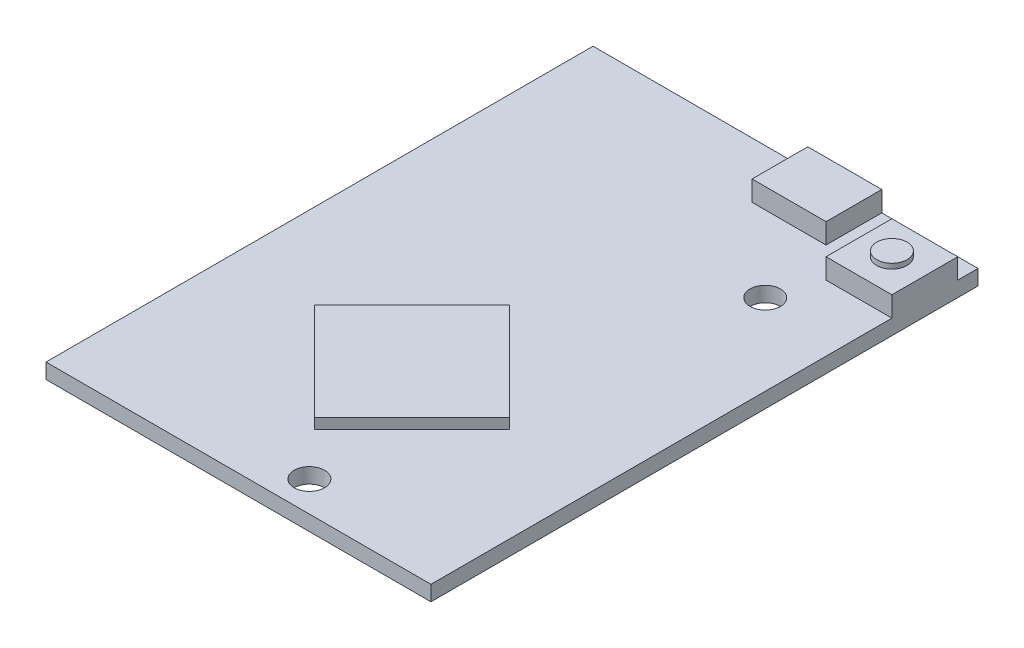
ISO-10303-21;
HEADER;
FILE_DESCRIPTION(('STEP AP214'),'2;1');
FILE_NAME('part.step','',(''),(''),'','','');
FILE_SCHEMA(('AUTOMOTIVE_DESIGN { 1 0 10303 214 1 1 1 1 }'));
ENDSEC;
DATA;
#1=APPLICATION_CONTEXT('core data for automotive mechanical design processes');
#2=APPLICATION_PROTOCOL_DEFINITION('international standard','automotive_design',2000,#1);
#3=PRODUCT_CONTEXT('',#1,'mechanical');
#4=PRODUCT('Part','Part','',(#3));
#5=PRODUCT_RELATED_PRODUCT_CATEGORY('part','',(#4));
#6=PRODUCT_DEFINITION_FORMATION('','',#4);
#7=PRODUCT_DEFINITION_CONTEXT('part definition',#1,'design');
#8=PRODUCT_DEFINITION('design','',#6,#7);
#9=PRODUCT_DEFINITION_SHAPE('','',#8);
#10=(LENGTH_UNIT() NAMED_UNIT(*) SI_UNIT(.MILLI.,.METRE.));
#11=(NAMED_UNIT(*) PLANE_ANGLE_UNIT() SI_UNIT($,.RADIAN.));
#12=(NAMED_UNIT(*) SI_UNIT($,.STERADIAN.) SOLID_ANGLE_UNIT());
#13=UNCERTAINTY_MEASURE_WITH_UNIT(LENGTH_MEASURE(1.E-05),#10,'distance_accuracy_value','');
#14=(GEOMETRIC_REPRESENTATION_CONTEXT(3) GLOBAL_UNCERTAINTY_ASSIGNED_CONTEXT((#13)) GLOBAL_UNIT_ASSIGNED_CONTEXT((#10,
#11,#12)) REPRESENTATION_CONTEXT('',''));
#15=CARTESIAN_POINT('',(0.,0.,0.));
#16=DIRECTION('',(0.,0.,1.));
#17=DIRECTION('',(1.,0.,0.));
#18=AXIS2_PLACEMENT_3D('',#15,#16,#17);
#19=CARTESIAN_POINT('',(0.,1.5,0.));
#20=DIRECTION('',(0.,1.,0.));
#21=DIRECTION('',(0.,0.,1.));
#22=AXIS2_PLACEMENT_3D('',#19,#20,#21);
#23=PLANE('',#22);
#24=CARTESIAN_POINT('',(11.,1.5,-14.));
#25=DIRECTION('',(0.,1.,0.));
#26=DIRECTION('',(0.,0.,1.));
#27=AXIS2_PLACEMENT_3D('',#24,#25,#26);
#28=CIRCLE('',#27,1.5);
#29=CARTESIAN_POINT('',(11.,1.5,-12.5));
#30=VERTEX_POINT('',#29);
#31=EDGE_CURVE('E512',#30,#30,#28,.T.);
#32=ORIENTED_EDGE('',*,*,#31,.F.);
#33=EDGE_LOOP('',(#32));
#34=FACE_BOUND('',#33,.T.);
#35=CARTESIAN_POINT('',(3.99999999999999,1.5,24.));
#36=DIRECTION('',(0.,1.,0.));
#37=DIRECTION('',(0.,0.,1.));
#38=AXIS2_PLACEMENT_3D('',#35,#36,#37);
#39=CIRCLE('',#38,1.5);
#40=CARTESIAN_POINT('',(3.99999999999999,1.5,25.5));
#41=VERTEX_POINT('',#40);
#42=EDGE_CURVE('E516',#41,#41,#39,.T.);
#43=ORIENTED_EDGE('',*,*,#42,.F.);
#44=EDGE_LOOP('',(#43));
#45=FACE_BOUND('',#44,.T.);
#46=DIRECTION('',(-0.707106781186548,0.,0.707106781186547));
#47=VECTOR('',#46,1.);
#48=CARTESIAN_POINT('',(-9.61665222413705,1.5,9.88334777586296));
#49=LINE('',#48,#47);
#50=CARTESIAN_POINT('',(0.,1.5,0.266695551725916));
#51=VERTEX_POINT('',#50);
#52=CARTESIAN_POINT('',(-9.61665222413705,1.5,9.88334777586296));
#53=VERTEX_POINT('',#52);
#54=EDGE_CURVE('E203',#51,#53,#49,.T.);
#55=ORIENTED_EDGE('',*,*,#54,.F.);
#56=DIRECTION('',(-0.707106781186548,0.,-0.707106781186547));
#57=VECTOR('',#56,1.);
#58=CARTESIAN_POINT('',(0.,1.5,0.266695551725916));
#59=LINE('',#58,#57);
#60=CARTESIAN_POINT('',(9.61665222413705,1.5,9.88334777586296));
#61=VERTEX_POINT('',#60);
#62=EDGE_CURVE('E208',#61,#51,#59,.T.);
#63=ORIENTED_EDGE('',*,*,#62,.F.);
#64=DIRECTION('',(0.707106781186548,0.,-0.707106781186547));
#65=VECTOR('',#64,1.);
#66=CARTESIAN_POINT('',(9.61665222413705,1.5,9.88334777586296));
#67=LINE('',#66,#65);
#68=CARTESIAN_POINT('',(0.,1.5,19.5));
#69=VERTEX_POINT('',#68);
#70=EDGE_CURVE('E220',#69,#61,#67,.T.);
#71=ORIENTED_EDGE('',*,*,#70,.F.);
#72=DIRECTION('',(0.707106781186547,0.,0.707106781186547));
#73=VECTOR('',#72,1.);
#74=CARTESIAN_POINT('',(0.,1.5,19.5));
#75=LINE('',#74,#73);
#76=EDGE_CURVE('E217',#53,#69,#75,.T.);
#77=ORIENTED_EDGE('',*,*,#76,.F.);
#78=EDGE_LOOP('',(#55,#63,#71,#77));
#79=FACE_BOUND('',#78,.T.);
#80=DIRECTION('',(0.,0.,1.));
#81=VECTOR('',#80,1.);
#82=CARTESIAN_POINT('',(12.5,1.5,-25.));
#83=LINE('',#82,#81);
#84=CARTESIAN_POINT('',(12.5,1.5,-25.));
#85=VERTEX_POINT('',#84);
#86=CARTESIAN_POINT('',(12.5,1.5,-18.5));
#87=VERTEX_POINT('',#86);
#88=EDGE_CURVE('E48',#85,#87,#83,.T.);
#89=ORIENTED_EDGE('',*,*,#88,.F.);
#90=DIRECTION('',(-1.,0.,0.));
#91=VECTOR('',#90,1.);
#92=CARTESIAN_POINT('',(19.,1.5,-25.));
#93=LINE('',#92,#91);
#94=CARTESIAN_POINT('',(19.,1.5,-25.));
#95=VERTEX_POINT('',#94);
#96=EDGE_CURVE('E527',#95,#85,#93,.T.);
#97=ORIENTED_EDGE('',*,*,#96,.F.);
#98=DIRECTION('',(0.,0.,-1.));
#99=VECTOR('',#98,1.);
#100=CARTESIAN_POINT('',(19.,1.5,-27.));
#101=LINE('',#100,#99);
#102=CARTESIAN_POINT('',(19.,1.5,-27.));
#103=VERTEX_POINT('',#102);
#104=EDGE_CURVE('E167',#95,#103,#101,.T.);
#105=ORIENTED_EDGE('',*,*,#104,.T.);
#106=DIRECTION('',(-1.,0.,0.));
#107=VECTOR('',#106,1.);
#108=CARTESIAN_POINT('',(-19.,1.5,-27.));
#109=LINE('',#108,#107);
#110=CARTESIAN_POINT('',(9.49999999999999,1.5,-27.));
#111=VERTEX_POINT('',#110);
#112=EDGE_CURVE('E240',#103,#111,#109,.T.);
#113=ORIENTED_EDGE('',*,*,#112,.T.);
#114=DIRECTION('',(0.,0.,-1.));
#115=VECTOR('',#114,1.);
#116=CARTESIAN_POINT('',(9.49999999999999,1.5,-27.));
#117=LINE('',#116,#115);
#118=CARTESIAN_POINT('',(9.49999999999999,1.5,-21.5));
#119=VERTEX_POINT('',#118);
#120=EDGE_CURVE('E181',#119,#111,#117,.T.);
#121=ORIENTED_EDGE('',*,*,#120,.F.);
#122=DIRECTION('',(1.,0.,0.));
#123=VECTOR('',#122,1.);
#124=CARTESIAN_POINT('',(2.19999999999999,1.5,-21.5));
#125=LINE('',#124,#123);
#126=CARTESIAN_POINT('',(2.19999999999999,1.5,-21.5));
#127=VERTEX_POINT('',#126);
#128=EDGE_CURVE('E171',#127,#119,#125,.T.);
#129=ORIENTED_EDGE('',*,*,#128,.F.);
#130=DIRECTION('',(0.,0.,1.));
#131=VECTOR('',#130,1.);
#132=CARTESIAN_POINT('',(2.19999999999999,1.5,-27.));
#133=LINE('',#132,#131);
#134=CARTESIAN_POINT('',(2.19999999999999,1.5,-27.));
#135=VERTEX_POINT('',#134);
#136=EDGE_CURVE('E168',#135,#127,#133,.T.);
#137=ORIENTED_EDGE('',*,*,#136,.F.);
#138=CARTESIAN_POINT('',(-19.,1.5,-27.));
#139=VERTEX_POINT('',#138);
#140=EDGE_CURVE('E239',#135,#139,#109,.T.);
#141=ORIENTED_EDGE('',*,*,#140,.T.);
#142=DIRECTION('',(0.,0.,1.));
#143=VECTOR('',#142,1.);
#144=CARTESIAN_POINT('',(-19.,1.5,-27.));
#145=LINE('',#144,#143);
#146=CARTESIAN_POINT('',(-19.,1.5,27.));
#147=VERTEX_POINT('',#146);
#148=EDGE_CURVE('E242',#139,#147,#145,.T.);
#149=ORIENTED_EDGE('',*,*,#148,.T.);
#150=DIRECTION('',(1.,0.,0.));
#151=VECTOR('',#150,1.);
#152=CARTESIAN_POINT('',(-19.,1.5,27.));
#153=LINE('',#152,#151);
#154=CARTESIAN_POINT('',(19.,1.5,27.));
#155=VERTEX_POINT('',#154);
#156=EDGE_CURVE('E244',#147,#155,#153,.T.);
#157=ORIENTED_EDGE('',*,*,#156,.T.);
#158=CARTESIAN_POINT('',(19.,1.5,-18.5));
#159=VERTEX_POINT('',#158);
#160=EDGE_CURVE('E237',#155,#159,#101,.T.);
#161=ORIENTED_EDGE('',*,*,#160,.T.);
#162=DIRECTION('',(1.,0.,0.));
#163=VECTOR('',#162,1.);
#164=CARTESIAN_POINT('',(19.,1.5,-18.5));
#165=LINE('',#164,#163);
#166=EDGE_CURVE('E53',#87,#159,#165,.T.);
#167=ORIENTED_EDGE('',*,*,#166,.F.);
#168=EDGE_LOOP('',(#89,#97,#105,#113,#121,#129,#137,#141,#149,#157,#161,#167));
#169=FACE_BOUND('',#168,.T.);
#170=ADVANCED_FACE('F32',(#34,#45,#79,#169),#23,.T.);
#171=CARTESIAN_POINT('',(19.,1.5,-27.));
#172=DIRECTION('',(-1.,0.,0.));
#173=DIRECTION('',(0.,0.,1.));
#174=AXIS2_PLACEMENT_3D('',#171,#172,#173);
#175=PLANE('',#174);
#176=DIRECTION('',(0.,0.,-1.));
#177=VECTOR('',#176,1.);
#178=CARTESIAN_POINT('',(19.,0.,-27.));
#179=LINE('',#178,#177);
#180=CARTESIAN_POINT('',(19.,0.,27.));
#181=VERTEX_POINT('',#180);
#182=CARTESIAN_POINT('',(19.,0.,-27.));
#183=VERTEX_POINT('',#182);
#184=EDGE_CURVE('E236',#181,#183,#179,.T.);
#185=ORIENTED_EDGE('',*,*,#184,.T.);
#186=DIRECTION('',(0.,-1.,0.));
#187=VECTOR('',#186,1.);
#188=CARTESIAN_POINT('',(19.,1.5,-27.));
#189=LINE('',#188,#187);
#190=EDGE_CURVE('E36',#103,#183,#189,.T.);
#191=ORIENTED_EDGE('',*,*,#190,.F.);
#192=ORIENTED_EDGE('',*,*,#104,.F.);
#193=DIRECTION('',(0.,-1.,0.));
#194=VECTOR('',#193,1.);
#195=CARTESIAN_POINT('',(19.,3.5,-25.));
#196=LINE('',#195,#194);
#197=CARTESIAN_POINT('',(19.,3.5,-25.));
#198=VERTEX_POINT('',#197);
#199=EDGE_CURVE('E149',#198,#95,#196,.T.);
#200=ORIENTED_EDGE('',*,*,#199,.F.);
#201=DIRECTION('',(0.,0.,-1.));
#202=VECTOR('',#201,1.);
#203=CARTESIAN_POINT('',(19.,3.5,-25.));
#204=LINE('',#203,#202);
#205=CARTESIAN_POINT('',(19.,3.5,-18.5));
#206=VERTEX_POINT('',#205);
#207=EDGE_CURVE('E155',#206,#198,#204,.T.);
#208=ORIENTED_EDGE('',*,*,#207,.F.);
#209=DIRECTION('',(0.,-1.,0.));
#210=VECTOR('',#209,1.);
#211=CARTESIAN_POINT('',(19.,3.5,-18.5));
#212=LINE('',#211,#210);
#213=EDGE_CURVE('E531',#206,#159,#212,.T.);
#214=ORIENTED_EDGE('',*,*,#213,.T.);
#215=ORIENTED_EDGE('',*,*,#160,.F.);
#216=DIRECTION('',(0.,-1.,0.));
#217=VECTOR('',#216,1.);
#218=CARTESIAN_POINT('',(19.,1.5,27.));
#219=LINE('',#218,#217);
#220=EDGE_CURVE('E246',#155,#181,#219,.T.);
#221=ORIENTED_EDGE('',*,*,#220,.T.);
#222=EDGE_LOOP('',(#185,#191,#192,#200,#208,#214,#215,#221));
#223=FACE_BOUND('',#222,.T.);
#224=ADVANCED_FACE('F34',(#223),#175,.F.);
#225=CARTESIAN_POINT('',(-19.,1.5,-27.));
#226=DIRECTION('',(0.,0.,1.));
#227=DIRECTION('',(1.,0.,0.));
#228=AXIS2_PLACEMENT_3D('',#225,#226,#227);
#229=PLANE('',#228);
#230=DIRECTION('',(-1.,0.,0.));
#231=VECTOR('',#230,1.);
#232=CARTESIAN_POINT('',(-19.,0.,-27.));
#233=LINE('',#232,#231);
#234=CARTESIAN_POINT('',(-19.,0.,-27.));
#235=VERTEX_POINT('',#234);
#236=EDGE_CURVE('E248',#183,#235,#233,.T.);
#237=ORIENTED_EDGE('',*,*,#236,.T.);
#238=DIRECTION('',(0.,-1.,0.));
#239=VECTOR('',#238,1.);
#240=CARTESIAN_POINT('',(-19.,1.5,-27.));
#241=LINE('',#240,#239);
#242=EDGE_CURVE('E258',#139,#235,#241,.T.);
#243=ORIENTED_EDGE('',*,*,#242,.F.);
#244=ORIENTED_EDGE('',*,*,#140,.F.);
#245=DIRECTION('',(0.,-1.,0.));
#246=VECTOR('',#245,1.);
#247=CARTESIAN_POINT('',(2.19999999999999,3.5,-27.));
#248=LINE('',#247,#246);
#249=CARTESIAN_POINT('',(2.19999999999999,3.5,-27.));
#250=VERTEX_POINT('',#249);
#251=EDGE_CURVE('E186',#250,#135,#248,.T.);
#252=ORIENTED_EDGE('',*,*,#251,.F.);
#253=DIRECTION('',(-1.,0.,0.));
#254=VECTOR('',#253,1.);
#255=CARTESIAN_POINT('',(2.19999999999999,3.5,-27.));
#256=LINE('',#255,#254);
#257=CARTESIAN_POINT('',(9.49999999999999,3.5,-27.));
#258=VERTEX_POINT('',#257);
#259=EDGE_CURVE('E185',#258,#250,#256,.T.);
#260=ORIENTED_EDGE('',*,*,#259,.F.);
#261=DIRECTION('',(0.,-1.,0.));
#262=VECTOR('',#261,1.);
#263=CARTESIAN_POINT('',(9.49999999999999,3.5,-27.));
#264=LINE('',#263,#262);
#265=EDGE_CURVE('E194',#258,#111,#264,.T.);
#266=ORIENTED_EDGE('',*,*,#265,.T.);
#267=ORIENTED_EDGE('',*,*,#112,.F.);
#268=ORIENTED_EDGE('',*,*,#190,.T.);
#269=EDGE_LOOP('',(#237,#243,#244,#252,#260,#266,#267,#268));
#270=FACE_BOUND('',#269,.T.);
#271=ADVANCED_FACE('F267',(#270),#229,.F.);
#272=CARTESIAN_POINT('',(-19.,1.5,-27.));
#273=DIRECTION('',(1.,0.,0.));
#274=DIRECTION('',(0.,0.,-1.));
#275=AXIS2_PLACEMENT_3D('',#272,#273,#274);
#276=PLANE('',#275);
#277=DIRECTION('',(0.,0.,1.));
#278=VECTOR('',#277,1.);
#279=CARTESIAN_POINT('',(-19.,0.,-27.));
#280=LINE('',#279,#278);
#281=CARTESIAN_POINT('',(-19.,0.,27.));
#282=VERTEX_POINT('',#281);
#283=EDGE_CURVE('E250',#235,#282,#280,.T.);
#284=ORIENTED_EDGE('',*,*,#283,.T.);
#285=DIRECTION('',(0.,-1.,0.));
#286=VECTOR('',#285,1.);
#287=CARTESIAN_POINT('',(-19.,1.5,27.));
#288=LINE('',#287,#286);
#289=EDGE_CURVE('E256',#147,#282,#288,.T.);
#290=ORIENTED_EDGE('',*,*,#289,.F.);
#291=ORIENTED_EDGE('',*,*,#148,.F.);
#292=ORIENTED_EDGE('',*,*,#242,.T.);
#293=EDGE_LOOP('',(#284,#290,#291,#292));
#294=FACE_BOUND('',#293,.T.);
#295=ADVANCED_FACE('F275',(#294),#276,.F.);
#296=CARTESIAN_POINT('',(-19.,1.5,27.));
#297=DIRECTION('',(0.,0.,-1.));
#298=DIRECTION('',(-1.,0.,0.));
#299=AXIS2_PLACEMENT_3D('',#296,#297,#298);
#300=PLANE('',#299);
#301=DIRECTION('',(1.,0.,0.));
#302=VECTOR('',#301,1.);
#303=CARTESIAN_POINT('',(-19.,0.,27.));
#304=LINE('',#303,#302);
#305=EDGE_CURVE('E252',#282,#181,#304,.T.);
#306=ORIENTED_EDGE('',*,*,#305,.T.);
#307=ORIENTED_EDGE('',*,*,#220,.F.);
#308=ORIENTED_EDGE('',*,*,#156,.F.);
#309=ORIENTED_EDGE('',*,*,#289,.T.);
#310=EDGE_LOOP('',(#306,#307,#308,#309));
#311=FACE_BOUND('',#310,.T.);
#312=ADVANCED_FACE('F278',(#311),#300,.F.);
#313=CARTESIAN_POINT('',(0.,0.,0.));
#314=DIRECTION('',(0.,1.,0.));
#315=DIRECTION('',(0.,0.,1.));
#316=AXIS2_PLACEMENT_3D('',#313,#314,#315);
#317=PLANE('',#316);
#318=CARTESIAN_POINT('',(11.,0.,-14.));
#319=DIRECTION('',(0.,1.,0.));
#320=DIRECTION('',(0.,0.,1.));
#321=AXIS2_PLACEMENT_3D('',#318,#319,#320);
#322=CIRCLE('',#321,1.5);
#323=CARTESIAN_POINT('',(11.,0.,-12.5));
#324=VERTEX_POINT('',#323);
#325=EDGE_CURVE('E515',#324,#324,#322,.T.);
#326=ORIENTED_EDGE('',*,*,#325,.T.);
#327=EDGE_LOOP('',(#326));
#328=FACE_BOUND('',#327,.T.);
#329=CARTESIAN_POINT('',(3.99999999999999,0.,24.));
#330=DIRECTION('',(0.,1.,0.));
#331=DIRECTION('',(0.,0.,1.));
#332=AXIS2_PLACEMENT_3D('',#329,#330,#331);
#333=CIRCLE('',#332,1.5);
#334=CARTESIAN_POINT('',(3.99999999999999,0.,25.5));
#335=VERTEX_POINT('',#334);
#336=EDGE_CURVE('E517',#335,#335,#333,.T.);
#337=ORIENTED_EDGE('',*,*,#336,.T.);
#338=EDGE_LOOP('',(#337));
#339=FACE_BOUND('',#338,.T.);
#340=ORIENTED_EDGE('',*,*,#184,.F.);
#341=ORIENTED_EDGE('',*,*,#305,.F.);
#342=ORIENTED_EDGE('',*,*,#283,.F.);
#343=ORIENTED_EDGE('',*,*,#236,.F.);
#344=EDGE_LOOP('',(#340,#341,#342,#343));
#345=FACE_BOUND('',#344,.T.);
#346=ADVANCED_FACE('F273',(#328,#339,#345),#317,.F.);
#347=CARTESIAN_POINT('',(-9.61665222413705,2.5,9.88334777586296));
#348=DIRECTION('',(0.707106781186547,0.,0.707106781186548));
#349=DIRECTION('',(0.707106781186548,0.,-0.707106781186547));
#350=AXIS2_PLACEMENT_3D('',#347,#348,#349);
#351=PLANE('',#350);
#352=ORIENTED_EDGE('',*,*,#54,.T.);
#353=DIRECTION('',(0.,-1.,0.));
#354=VECTOR('',#353,1.);
#355=CARTESIAN_POINT('',(-9.61665222413705,2.5,9.88334777586296));
#356=LINE('',#355,#354);
#357=CARTESIAN_POINT('',(-9.61665222413705,2.5,9.88334777586296));
#358=VERTEX_POINT('',#357);
#359=EDGE_CURVE('E233',#358,#53,#356,.T.);
#360=ORIENTED_EDGE('',*,*,#359,.F.);
#361=DIRECTION('',(-0.707106781186548,0.,0.707106781186547));
#362=VECTOR('',#361,1.);
#363=CARTESIAN_POINT('',(-9.61665222413705,2.5,9.88334777586296));
#364=LINE('',#363,#362);
#365=CARTESIAN_POINT('',(0.,2.5,0.266695551725916));
#366=VERTEX_POINT('',#365);
#367=EDGE_CURVE('E204',#366,#358,#364,.T.);
#368=ORIENTED_EDGE('',*,*,#367,.F.);
#369=DIRECTION('',(0.,-1.,0.));
#370=VECTOR('',#369,1.);
#371=CARTESIAN_POINT('',(0.,2.5,0.266695551725916));
#372=LINE('',#371,#370);
#373=EDGE_CURVE('E214',#366,#51,#372,.T.);
#374=ORIENTED_EDGE('',*,*,#373,.T.);
#375=EDGE_LOOP('',(#352,#360,#368,#374));
#376=FACE_BOUND('',#375,.T.);
#377=ADVANCED_FACE('F314',(#376),#351,.F.);
#378=CARTESIAN_POINT('',(0.,2.5,19.5));
#379=DIRECTION('',(0.707106781186547,0.,-0.707106781186547));
#380=DIRECTION('',(-0.707106781186548,0.,-0.707106781186548));
#381=AXIS2_PLACEMENT_3D('',#378,#379,#380);
#382=PLANE('',#381);
#383=ORIENTED_EDGE('',*,*,#76,.T.);
#384=DIRECTION('',(0.,-1.,0.));
#385=VECTOR('',#384,1.);
#386=CARTESIAN_POINT('',(0.,2.5,19.5));
#387=LINE('',#386,#385);
#388=CARTESIAN_POINT('',(0.,2.5,19.5));
#389=VERTEX_POINT('',#388);
#390=EDGE_CURVE('E230',#389,#69,#387,.T.);
#391=ORIENTED_EDGE('',*,*,#390,.F.);
#392=DIRECTION('',(0.707106781186547,0.,0.707106781186547));
#393=VECTOR('',#392,1.);
#394=CARTESIAN_POINT('',(0.,2.5,19.5));
#395=LINE('',#394,#393);
#396=EDGE_CURVE('E207',#358,#389,#395,.T.);
#397=ORIENTED_EDGE('',*,*,#396,.F.);
#398=ORIENTED_EDGE('',*,*,#359,.T.);
#399=EDGE_LOOP('',(#383,#391,#397,#398));
#400=FACE_BOUND('',#399,.T.);
#401=ADVANCED_FACE('F347',(#400),#382,.F.);
#402=CARTESIAN_POINT('',(9.61665222413705,2.5,9.88334777586296));
#403=DIRECTION('',(-0.707106781186547,0.,-0.707106781186548));
#404=DIRECTION('',(-0.707106781186548,0.,0.707106781186547));
#405=AXIS2_PLACEMENT_3D('',#402,#403,#404);
#406=PLANE('',#405);
#407=ORIENTED_EDGE('',*,*,#70,.T.);
#408=DIRECTION('',(0.,-1.,0.));
#409=VECTOR('',#408,1.);
#410=CARTESIAN_POINT('',(9.61665222413705,2.5,9.88334777586296));
#411=LINE('',#410,#409);
#412=CARTESIAN_POINT('',(9.61665222413705,2.5,9.88334777586296));
#413=VERTEX_POINT('',#412);
#414=EDGE_CURVE('E227',#413,#61,#411,.T.);
#415=ORIENTED_EDGE('',*,*,#414,.F.);
#416=DIRECTION('',(0.707106781186548,0.,-0.707106781186547));
#417=VECTOR('',#416,1.);
#418=CARTESIAN_POINT('',(9.61665222413705,2.5,9.88334777586296));
#419=LINE('',#418,#417);
#420=EDGE_CURVE('E210',#389,#413,#419,.T.);
#421=ORIENTED_EDGE('',*,*,#420,.F.);
#422=ORIENTED_EDGE('',*,*,#390,.T.);
#423=EDGE_LOOP('',(#407,#415,#421,#422));
#424=FACE_BOUND('',#423,.T.);
#425=ADVANCED_FACE('F354',(#424),#406,.F.);
#426=CARTESIAN_POINT('',(0.,2.5,0.266695551725916));
#427=DIRECTION('',(-0.707106781186547,0.,0.707106781186548));
#428=DIRECTION('',(0.707106781186548,0.,0.707106781186547));
#429=AXIS2_PLACEMENT_3D('',#426,#427,#428);
#430=PLANE('',#429);
#431=ORIENTED_EDGE('',*,*,#62,.T.);
#432=ORIENTED_EDGE('',*,*,#373,.F.);
#433=DIRECTION('',(-0.707106781186548,0.,-0.707106781186547));
#434=VECTOR('',#433,1.);
#435=CARTESIAN_POINT('',(0.,2.5,0.266695551725916));
#436=LINE('',#435,#434);
#437=EDGE_CURVE('E212',#413,#366,#436,.T.);
#438=ORIENTED_EDGE('',*,*,#437,.F.);
#439=ORIENTED_EDGE('',*,*,#414,.T.);
#440=EDGE_LOOP('',(#431,#432,#438,#439));
#441=FACE_BOUND('',#440,.T.);
#442=ADVANCED_FACE('F361',(#441),#430,.F.);
#443=CARTESIAN_POINT('',(0.,2.5,0.));
#444=DIRECTION('',(0.,-1.,0.));
#445=DIRECTION('',(0.,0.,-1.));
#446=AXIS2_PLACEMENT_3D('',#443,#444,#445);
#447=PLANE('',#446);
#448=ORIENTED_EDGE('',*,*,#367,.T.);
#449=ORIENTED_EDGE('',*,*,#396,.T.);
#450=ORIENTED_EDGE('',*,*,#420,.T.);
#451=ORIENTED_EDGE('',*,*,#437,.T.);
#452=EDGE_LOOP('',(#448,#449,#450,#451));
#453=FACE_BOUND('',#452,.T.);
#454=ADVANCED_FACE('F302',(#453),#447,.F.);
#455=CARTESIAN_POINT('',(2.19999999999999,3.5,-27.));
#456=DIRECTION('',(1.,0.,0.));
#457=DIRECTION('',(0.,0.,-1.));
#458=AXIS2_PLACEMENT_3D('',#455,#456,#457);
#459=PLANE('',#458);
#460=ORIENTED_EDGE('',*,*,#136,.T.);
#461=DIRECTION('',(0.,-1.,0.));
#462=VECTOR('',#461,1.);
#463=CARTESIAN_POINT('',(2.19999999999999,3.5,-21.5));
#464=LINE('',#463,#462);
#465=CARTESIAN_POINT('',(2.19999999999999,3.5,-21.5));
#466=VERTEX_POINT('',#465);
#467=EDGE_CURVE('E200',#466,#127,#464,.T.);
#468=ORIENTED_EDGE('',*,*,#467,.F.);
#469=DIRECTION('',(0.,0.,1.));
#470=VECTOR('',#469,1.);
#471=CARTESIAN_POINT('',(2.19999999999999,3.5,-27.));
#472=LINE('',#471,#470);
#473=EDGE_CURVE('E177',#250,#466,#472,.T.);
#474=ORIENTED_EDGE('',*,*,#473,.F.);
#475=ORIENTED_EDGE('',*,*,#251,.T.);
#476=EDGE_LOOP('',(#460,#468,#474,#475));
#477=FACE_BOUND('',#476,.T.);
#478=ADVANCED_FACE('F285',(#477),#459,.F.);
#479=CARTESIAN_POINT('',(2.19999999999999,3.5,-21.5));
#480=DIRECTION('',(0.,0.,-1.));
#481=DIRECTION('',(-1.,0.,0.));
#482=AXIS2_PLACEMENT_3D('',#479,#480,#481);
#483=PLANE('',#482);
#484=ORIENTED_EDGE('',*,*,#128,.T.);
#485=DIRECTION('',(0.,-1.,0.));
#486=VECTOR('',#485,1.);
#487=CARTESIAN_POINT('',(9.49999999999999,3.5,-21.5));
#488=LINE('',#487,#486);
#489=CARTESIAN_POINT('',(9.49999999999999,3.5,-21.5));
#490=VERTEX_POINT('',#489);
#491=EDGE_CURVE('E197',#490,#119,#488,.T.);
#492=ORIENTED_EDGE('',*,*,#491,.F.);
#493=DIRECTION('',(1.,0.,0.));
#494=VECTOR('',#493,1.);
#495=CARTESIAN_POINT('',(2.19999999999999,3.5,-21.5));
#496=LINE('',#495,#494);
#497=EDGE_CURVE('E180',#466,#490,#496,.T.);
#498=ORIENTED_EDGE('',*,*,#497,.F.);
#499=ORIENTED_EDGE('',*,*,#467,.T.);
#500=EDGE_LOOP('',(#484,#492,#498,#499));
#501=FACE_BOUND('',#500,.T.);
#502=ADVANCED_FACE('F294',(#501),#483,.F.);
#503=CARTESIAN_POINT('',(9.49999999999999,3.5,-27.));
#504=DIRECTION('',(-1.,0.,0.));
#505=DIRECTION('',(0.,0.,1.));
#506=AXIS2_PLACEMENT_3D('',#503,#504,#505);
#507=PLANE('',#506);
#508=ORIENTED_EDGE('',*,*,#120,.T.);
#509=ORIENTED_EDGE('',*,*,#265,.F.);
#510=DIRECTION('',(0.,0.,-1.));
#511=VECTOR('',#510,1.);
#512=CARTESIAN_POINT('',(9.49999999999999,3.5,-27.));
#513=LINE('',#512,#511);
#514=EDGE_CURVE('E183',#490,#258,#513,.T.);
#515=ORIENTED_EDGE('',*,*,#514,.F.);
#516=ORIENTED_EDGE('',*,*,#491,.T.);
#517=EDGE_LOOP('',(#508,#509,#515,#516));
#518=FACE_BOUND('',#517,.T.);
#519=ADVANCED_FACE('F292',(#518),#507,.F.);
#520=CARTESIAN_POINT('',(0.,3.5,0.));
#521=DIRECTION('',(0.,1.,0.));
#522=DIRECTION('',(0.,0.,1.));
#523=AXIS2_PLACEMENT_3D('',#520,#521,#522);
#524=PLANE('',#523);
#525=ORIENTED_EDGE('',*,*,#473,.T.);
#526=ORIENTED_EDGE('',*,*,#497,.T.);
#527=ORIENTED_EDGE('',*,*,#514,.T.);
#528=ORIENTED_EDGE('',*,*,#259,.T.);
#529=EDGE_LOOP('',(#525,#526,#527,#528));
#530=FACE_BOUND('',#529,.T.);
#531=ADVANCED_FACE('F287',(#530),#524,.T.);
#532=CARTESIAN_POINT('',(19.,3.5,-25.));
#533=DIRECTION('',(0.,0.,1.));
#534=DIRECTION('',(1.,0.,0.));
#535=AXIS2_PLACEMENT_3D('',#532,#533,#534);
#536=PLANE('',#535);
#537=ORIENTED_EDGE('',*,*,#96,.T.);
#538=DIRECTION('',(0.,-1.,0.));
#539=VECTOR('',#538,1.);
#540=CARTESIAN_POINT('',(12.5,3.5,-25.));
#541=LINE('',#540,#539);
#542=CARTESIAN_POINT('',(12.5,3.5,-25.));
#543=VERTEX_POINT('',#542);
#544=EDGE_CURVE('E151',#543,#85,#541,.T.);
#545=ORIENTED_EDGE('',*,*,#544,.F.);
#546=DIRECTION('',(-1.,0.,0.));
#547=VECTOR('',#546,1.);
#548=CARTESIAN_POINT('',(19.,3.5,-25.));
#549=LINE('',#548,#547);
#550=EDGE_CURVE('E145',#198,#543,#549,.T.);
#551=ORIENTED_EDGE('',*,*,#550,.F.);
#552=ORIENTED_EDGE('',*,*,#199,.T.);
#553=EDGE_LOOP('',(#537,#545,#551,#552));
#554=FACE_BOUND('',#553,.T.);
#555=ADVANCED_FACE('F147',(#554),#536,.F.);
#556=CARTESIAN_POINT('',(12.5,3.5,-25.));
#557=DIRECTION('',(1.,0.,0.));
#558=DIRECTION('',(0.,0.,-1.));
#559=AXIS2_PLACEMENT_3D('',#556,#557,#558);
#560=PLANE('',#559);
#561=ORIENTED_EDGE('',*,*,#88,.T.);
#562=DIRECTION('',(0.,-1.,0.));
#563=VECTOR('',#562,1.);
#564=CARTESIAN_POINT('',(12.5,3.5,-18.5));
#565=LINE('',#564,#563);
#566=CARTESIAN_POINT('',(12.5,3.5,-18.5));
#567=VERTEX_POINT('',#566);
#568=EDGE_CURVE('E173',#567,#87,#565,.T.);
#569=ORIENTED_EDGE('',*,*,#568,.F.);
#570=DIRECTION('',(0.,0.,1.));
#571=VECTOR('',#570,1.);
#572=CARTESIAN_POINT('',(12.5,3.5,-25.));
#573=LINE('',#572,#571);
#574=EDGE_CURVE('E154',#543,#567,#573,.T.);
#575=ORIENTED_EDGE('',*,*,#574,.F.);
#576=ORIENTED_EDGE('',*,*,#544,.T.);
#577=EDGE_LOOP('',(#561,#569,#575,#576));
#578=FACE_BOUND('',#577,.T.);
#579=ADVANCED_FACE('F407',(#578),#560,.F.);
#580=CARTESIAN_POINT('',(19.,3.5,-18.5));
#581=DIRECTION('',(0.,0.,-1.));
#582=DIRECTION('',(-1.,0.,0.));
#583=AXIS2_PLACEMENT_3D('',#580,#581,#582);
#584=PLANE('',#583);
#585=ORIENTED_EDGE('',*,*,#166,.T.);
#586=ORIENTED_EDGE('',*,*,#213,.F.);
#587=DIRECTION('',(1.,0.,0.));
#588=VECTOR('',#587,1.);
#589=CARTESIAN_POINT('',(19.,3.5,-18.5));
#590=LINE('',#589,#588);
#591=EDGE_CURVE('E160',#567,#206,#590,.T.);
#592=ORIENTED_EDGE('',*,*,#591,.F.);
#593=ORIENTED_EDGE('',*,*,#568,.T.);
#594=EDGE_LOOP('',(#585,#586,#592,#593));
#595=FACE_BOUND('',#594,.T.);
#596=ADVANCED_FACE('F416',(#595),#584,.F.);
#597=CARTESIAN_POINT('',(0.,3.5,0.));
#598=DIRECTION('',(0.,-1.,0.));
#599=DIRECTION('',(0.,0.,-1.));
#600=AXIS2_PLACEMENT_3D('',#597,#598,#599);
#601=PLANE('',#600);
#602=CARTESIAN_POINT('',(15.75,3.5,-21.75));
#603=DIRECTION('',(0.,1.,0.));
#604=DIRECTION('',(0.,0.,1.));
#605=AXIS2_PLACEMENT_3D('',#602,#603,#604);
#606=CIRCLE('',#605,1.5);
#607=CARTESIAN_POINT('',(15.75,3.5,-20.25));
#608=VERTEX_POINT('',#607);
#609=EDGE_CURVE('E11',#608,#608,#606,.T.);
#610=ORIENTED_EDGE('',*,*,#609,.F.);
#611=EDGE_LOOP('',(#610));
#612=FACE_BOUND('',#611,.T.);
#613=ORIENTED_EDGE('',*,*,#207,.T.);
#614=ORIENTED_EDGE('',*,*,#550,.T.);
#615=ORIENTED_EDGE('',*,*,#574,.T.);
#616=ORIENTED_EDGE('',*,*,#591,.T.);
#617=EDGE_LOOP('',(#613,#614,#615,#616));
#618=FACE_BOUND('',#617,.T.);
#619=ADVANCED_FACE('F158',(#612,#618),#601,.F.);
#620=CARTESIAN_POINT('',(15.75,4.,-21.75));
#621=DIRECTION('',(0.,-1.,0.));
#622=DIRECTION('',(0.,0.,-1.));
#623=AXIS2_PLACEMENT_3D('',#620,#621,#622);
#624=CYLINDRICAL_SURFACE('',#623,1.5);
#625=CARTESIAN_POINT('',(15.75,4.,-21.75));
#626=DIRECTION('',(0.,1.,0.));
#627=DIRECTION('',(0.,0.,1.));
#628=AXIS2_PLACEMENT_3D('',#625,#626,#627);
#629=CIRCLE('',#628,1.5);
#630=CARTESIAN_POINT('',(15.75,4.,-20.25));
#631=VERTEX_POINT('',#630);
#632=EDGE_CURVE('E525',#631,#631,#629,.T.);
#633=ORIENTED_EDGE('',*,*,#632,.F.);
#634=EDGE_LOOP('',(#633));
#635=FACE_BOUND('',#634,.T.);
#636=ORIENTED_EDGE('',*,*,#609,.T.);
#637=EDGE_LOOP('',(#636));
#638=FACE_BOUND('',#637,.T.);
#639=ADVANCED_FACE('F435',(#635,#638),#624,.T.);
#640=CARTESIAN_POINT('',(15.75,4.,-21.75));
#641=DIRECTION('',(0.,1.,0.));
#642=DIRECTION('',(0.,0.,1.));
#643=AXIS2_PLACEMENT_3D('',#640,#641,#642);
#644=PLANE('',#643);
#645=ORIENTED_EDGE('',*,*,#632,.T.);
#646=EDGE_LOOP('',(#645));
#647=FACE_BOUND('',#646,.T.);
#648=ADVANCED_FACE('F445',(#647),#644,.T.);
#649=CARTESIAN_POINT('',(3.99999999999999,0.,24.));
#650=DIRECTION('',(0.,1.,0.));
#651=DIRECTION('',(0.,0.,1.));
#652=AXIS2_PLACEMENT_3D('',#649,#650,#651);
#653=CYLINDRICAL_SURFACE('',#652,1.5);
#654=ORIENTED_EDGE('',*,*,#42,.T.);
#655=EDGE_LOOP('',(#654));
#656=FACE_BOUND('',#655,.T.);
#657=ORIENTED_EDGE('',*,*,#336,.F.);
#658=EDGE_LOOP('',(#657));
#659=FACE_BOUND('',#658,.T.);
#660=ADVANCED_FACE('F454',(#656,#659),#653,.F.);
#661=CARTESIAN_POINT('',(11.,0.,-14.));
#662=DIRECTION('',(0.,1.,0.));
#663=DIRECTION('',(0.,0.,1.));
#664=AXIS2_PLACEMENT_3D('',#661,#662,#663);
#665=CYLINDRICAL_SURFACE('',#664,1.5);
#666=ORIENTED_EDGE('',*,*,#31,.T.);
#667=EDGE_LOOP('',(#666));
#668=FACE_BOUND('',#667,.T.);
#669=ORIENTED_EDGE('',*,*,#325,.F.);
#670=EDGE_LOOP('',(#669));
#671=FACE_BOUND('',#670,.T.);
#672=ADVANCED_FACE('F496',(#668,#671),#665,.F.);
#673=CLOSED_SHELL('',(#170,#224,#271,#295,#312,#346,#377,#401,#425,#442,#454,#478,#502,#519,
#531,#555,#579,#596,#619,#639,#648,#660,#672));
#674=MANIFOLD_SOLID_BREP('B2',#673);
#675=ADVANCED_BREP_SHAPE_REPRESENTATION('',(#18,#674),#14);
#676=SHAPE_DEFINITION_REPRESENTATION(#9,#675);
ENDSEC;
END-ISO-10303-21;
